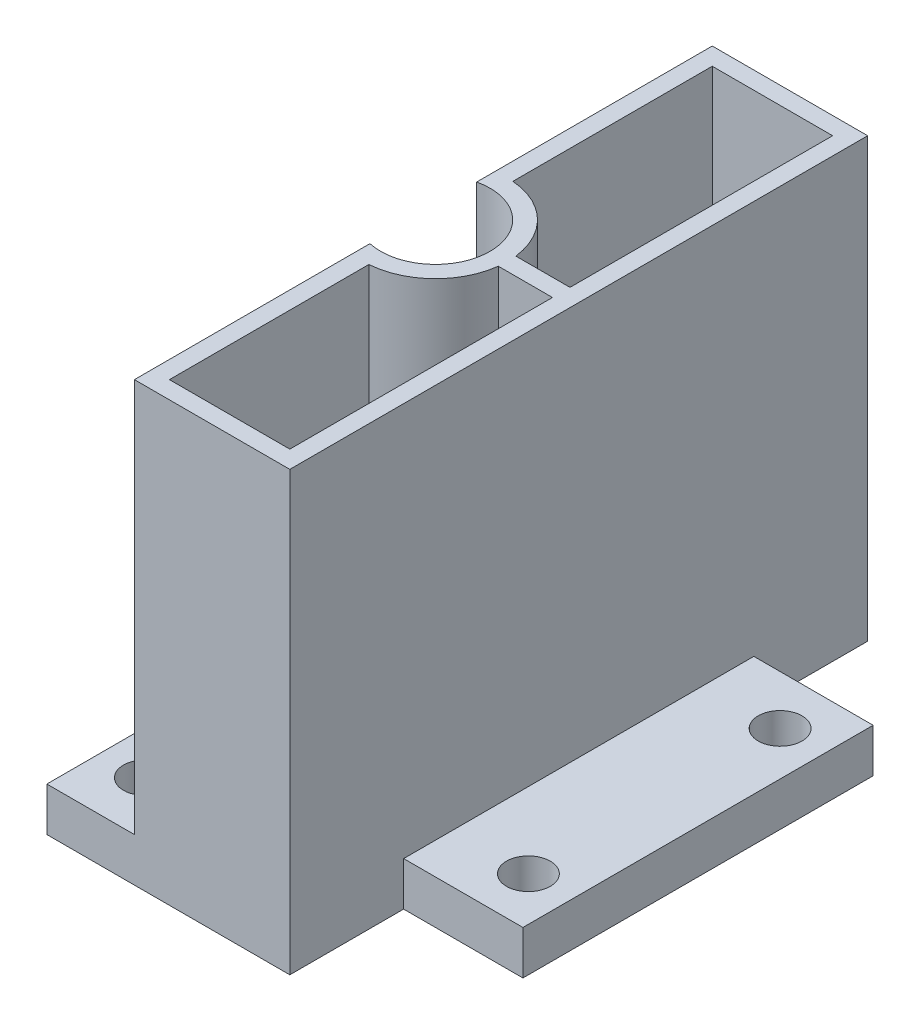
ISO-10303-21;
HEADER;
FILE_DESCRIPTION(('STEP AP214'),'2;1');
FILE_NAME('part.step','',(''),(''),'','','');
FILE_SCHEMA(('AUTOMOTIVE_DESIGN { 1 0 10303 214 1 1 1 1 }'));
ENDSEC;
DATA;
#1=APPLICATION_CONTEXT('core data for automotive mechanical design processes');
#2=APPLICATION_PROTOCOL_DEFINITION('international standard','automotive_design',2000,#1);
#3=PRODUCT_CONTEXT('',#1,'mechanical');
#4=PRODUCT('Part','Part','',(#3));
#5=PRODUCT_RELATED_PRODUCT_CATEGORY('part','',(#4));
#6=PRODUCT_DEFINITION_FORMATION('','',#4);
#7=PRODUCT_DEFINITION_CONTEXT('part definition',#1,'design');
#8=PRODUCT_DEFINITION('design','',#6,#7);
#9=PRODUCT_DEFINITION_SHAPE('','',#8);
#10=(LENGTH_UNIT() NAMED_UNIT(*) SI_UNIT(.MILLI.,.METRE.));
#11=(NAMED_UNIT(*) PLANE_ANGLE_UNIT() SI_UNIT($,.RADIAN.));
#12=(NAMED_UNIT(*) SI_UNIT($,.STERADIAN.) SOLID_ANGLE_UNIT());
#13=UNCERTAINTY_MEASURE_WITH_UNIT(LENGTH_MEASURE(1.E-05),#10,'distance_accuracy_value','');
#14=(GEOMETRIC_REPRESENTATION_CONTEXT(3) GLOBAL_UNCERTAINTY_ASSIGNED_CONTEXT((#13)) GLOBAL_UNIT_ASSIGNED_CONTEXT((#10,
#11,#12)) REPRESENTATION_CONTEXT('',''));
#15=CARTESIAN_POINT('',(0.,0.,0.));
#16=DIRECTION('',(0.,0.,1.));
#17=DIRECTION('',(1.,0.,0.));
#18=AXIS2_PLACEMENT_3D('',#15,#16,#17);
#19=CARTESIAN_POINT('',(-0.906603032067286,20.,0.));
#20=DIRECTION('',(-1.,0.,0.));
#21=DIRECTION('',(0.,0.,1.));
#22=AXIS2_PLACEMENT_3D('',#19,#20,#21);
#23=PLANE('',#22);
#24=DIRECTION('',(0.,0.,-1.));
#25=VECTOR('',#24,1.);
#26=CARTESIAN_POINT('',(-0.906603032067286,0.,0.));
#27=LINE('',#26,#25);
#28=CARTESIAN_POINT('',(-0.906603032067321,0.,3.19999999999997));
#29=VERTEX_POINT('',#28);
#30=CARTESIAN_POINT('',(-0.906603032067313,0.,2.43874967965067));
#31=VERTEX_POINT('',#30);
#32=EDGE_CURVE('E442',#29,#31,#27,.T.);
#33=ORIENTED_EDGE('',*,*,#32,.F.);
#34=DIRECTION('',(0.,-1.,0.));
#35=VECTOR('',#34,1.);
#36=CARTESIAN_POINT('',(-0.906603032067321,2.,3.19999999999997));
#37=LINE('',#36,#35);
#38=CARTESIAN_POINT('',(-0.906603032067321,2.,3.19999999999997));
#39=VERTEX_POINT('',#38);
#40=EDGE_CURVE('E59',#39,#29,#37,.T.);
#41=ORIENTED_EDGE('',*,*,#40,.F.);
#42=DIRECTION('',(0.,0.,-1.));
#43=VECTOR('',#42,1.);
#44=CARTESIAN_POINT('',(-0.906603032067286,2.,0.));
#45=LINE('',#44,#43);
#46=CARTESIAN_POINT('',(-0.906603032067431,2.,13.2));
#47=VERTEX_POINT('',#46);
#48=EDGE_CURVE('E246',#47,#39,#45,.T.);
#49=ORIENTED_EDGE('',*,*,#48,.F.);
#50=DIRECTION('',(0.,-1.,0.));
#51=VECTOR('',#50,1.);
#52=CARTESIAN_POINT('',(-0.906603032067431,20.,13.2));
#53=LINE('',#52,#51);
#54=CARTESIAN_POINT('',(-0.906603032067431,20.,13.2));
#55=VERTEX_POINT('',#54);
#56=EDGE_CURVE('E244',#55,#47,#53,.T.);
#57=ORIENTED_EDGE('',*,*,#56,.F.);
#58=DIRECTION('',(0.,0.,-1.));
#59=VECTOR('',#58,1.);
#60=CARTESIAN_POINT('',(-0.906603032067286,20.,0.));
#61=LINE('',#60,#59);
#62=CARTESIAN_POINT('',(-0.906603032067313,20.,2.43874967965067));
#63=VERTEX_POINT('',#62);
#64=EDGE_CURVE('E383',#55,#63,#61,.T.);
#65=ORIENTED_EDGE('',*,*,#64,.T.);
#66=DIRECTION('',(0.,-1.,0.));
#67=VECTOR('',#66,1.);
#68=CARTESIAN_POINT('',(-0.906603032067313,20.,2.43874967965067));
#69=LINE('',#68,#67);
#70=EDGE_CURVE('E45',#63,#31,#69,.T.);
#71=ORIENTED_EDGE('',*,*,#70,.T.);
#72=EDGE_LOOP('',(#33,#41,#49,#57,#65,#71));
#73=FACE_BOUND('',#72,.T.);
#74=ADVANCED_FACE('F41',(#73),#23,.T.);
#75=CARTESIAN_POINT('',(6.19339696793819,20.,0.));
#76=DIRECTION('',(-1.,0.,0.));
#77=DIRECTION('',(0.,0.,1.));
#78=AXIS2_PLACEMENT_3D('',#75,#76,#77);
#79=PLANE('',#78);
#80=DIRECTION('',(0.,-1.,0.));
#81=VECTOR('',#80,1.);
#82=CARTESIAN_POINT('',(6.19339696793822,2.,7.99999999999994));
#83=LINE('',#82,#81);
#84=CARTESIAN_POINT('',(6.19339696793822,2.,7.99999999999994));
#85=VERTEX_POINT('',#84);
#86=CARTESIAN_POINT('',(6.19339696793822,0.,7.99999999999994));
#87=VERTEX_POINT('',#86);
#88=EDGE_CURVE('E372',#85,#87,#83,.T.);
#89=ORIENTED_EDGE('',*,*,#88,.F.);
#90=DIRECTION('',(0.,0.,-1.));
#91=VECTOR('',#90,1.);
#92=CARTESIAN_POINT('',(6.19339696793819,2.,0.));
#93=LINE('',#92,#91);
#94=CARTESIAN_POINT('',(6.19339696793816,2.,-8.00000000000006));
#95=VERTEX_POINT('',#94);
#96=EDGE_CURVE('E338',#85,#95,#93,.T.);
#97=ORIENTED_EDGE('',*,*,#96,.T.);
#98=DIRECTION('',(0.,-1.,0.));
#99=VECTOR('',#98,1.);
#100=CARTESIAN_POINT('',(6.19339696793816,2.,-8.00000000000006));
#101=LINE('',#100,#99);
#102=CARTESIAN_POINT('',(6.19339696793816,0.,-8.00000000000006));
#103=VERTEX_POINT('',#102);
#104=EDGE_CURVE('E375',#95,#103,#101,.T.);
#105=ORIENTED_EDGE('',*,*,#104,.T.);
#106=DIRECTION('',(0.,0.,-1.));
#107=VECTOR('',#106,1.);
#108=CARTESIAN_POINT('',(6.19339696793819,0.,0.));
#109=LINE('',#108,#107);
#110=CARTESIAN_POINT('',(6.19339696793835,0.,-13.2));
#111=VERTEX_POINT('',#110);
#112=EDGE_CURVE('E448',#103,#111,#109,.T.);
#113=ORIENTED_EDGE('',*,*,#112,.T.);
#114=DIRECTION('',(0.,-1.,0.));
#115=VECTOR('',#114,1.);
#116=CARTESIAN_POINT('',(6.19339696793835,20.,-13.2));
#117=LINE('',#116,#115);
#118=CARTESIAN_POINT('',(6.19339696793835,20.,-13.2));
#119=VERTEX_POINT('',#118);
#120=EDGE_CURVE('E533',#119,#111,#117,.T.);
#121=ORIENTED_EDGE('',*,*,#120,.F.);
#122=DIRECTION('',(0.,0.,-1.));
#123=VECTOR('',#122,1.);
#124=CARTESIAN_POINT('',(6.19339696793819,20.,0.));
#125=LINE('',#124,#123);
#126=CARTESIAN_POINT('',(6.19339696793811,20.,13.2));
#127=VERTEX_POINT('',#126);
#128=EDGE_CURVE('E391',#127,#119,#125,.T.);
#129=ORIENTED_EDGE('',*,*,#128,.F.);
#130=DIRECTION('',(0.,-1.,0.));
#131=VECTOR('',#130,1.);
#132=CARTESIAN_POINT('',(6.19339696793811,20.,13.2));
#133=LINE('',#132,#131);
#134=CARTESIAN_POINT('',(6.19339696793811,0.,13.2));
#135=VERTEX_POINT('',#134);
#136=EDGE_CURVE('E537',#127,#135,#133,.T.);
#137=ORIENTED_EDGE('',*,*,#136,.T.);
#138=EDGE_CURVE('E449',#135,#87,#109,.T.);
#139=ORIENTED_EDGE('',*,*,#138,.T.);
#140=EDGE_LOOP('',(#89,#97,#105,#113,#121,#129,#137,#139));
#141=FACE_BOUND('',#140,.T.);
#142=ADVANCED_FACE('F575',(#141),#79,.F.);
#143=CARTESIAN_POINT('',(-0.106603032064528,20.,0.));
#144=DIRECTION('',(-1.,0.,0.));
#145=DIRECTION('',(0.,0.,1.));
#146=AXIS2_PLACEMENT_3D('',#143,#144,#145);
#147=PLANE('',#146);
#148=DIRECTION('',(0.,0.,-1.));
#149=VECTOR('',#148,1.);
#150=CARTESIAN_POINT('',(-0.106603032064528,0.,0.));
#151=LINE('',#150,#149);
#152=CARTESIAN_POINT('',(-0.106603032064528,0.,12.3999999999999));
#153=VERTEX_POINT('',#152);
#154=CARTESIAN_POINT('',(-0.106603032064528,0.,3.29051667675444));
#155=VERTEX_POINT('',#154);
#156=EDGE_CURVE('E480',#153,#155,#151,.T.);
#157=ORIENTED_EDGE('',*,*,#156,.T.);
#158=DIRECTION('',(0.,-1.,0.));
#159=VECTOR('',#158,1.);
#160=CARTESIAN_POINT('',(-0.106603032064528,20.,3.29051667675444));
#161=LINE('',#160,#159);
#162=CARTESIAN_POINT('',(-0.106603032064528,20.,3.29051667675444));
#163=VERTEX_POINT('',#162);
#164=EDGE_CURVE('E11',#163,#155,#161,.T.);
#165=ORIENTED_EDGE('',*,*,#164,.F.);
#166=DIRECTION('',(0.,0.,-1.));
#167=VECTOR('',#166,1.);
#168=CARTESIAN_POINT('',(-0.106603032064528,20.,0.));
#169=LINE('',#168,#167);
#170=CARTESIAN_POINT('',(-0.106603032064528,20.,12.3999999999999));
#171=VERTEX_POINT('',#170);
#172=EDGE_CURVE('E420',#171,#163,#169,.T.);
#173=ORIENTED_EDGE('',*,*,#172,.F.);
#174=DIRECTION('',(0.,-1.,0.));
#175=VECTOR('',#174,1.);
#176=CARTESIAN_POINT('',(-0.106603032064528,20.,12.3999999999999));
#177=LINE('',#176,#175);
#178=EDGE_CURVE('E498',#171,#153,#177,.T.);
#179=ORIENTED_EDGE('',*,*,#178,.T.);
#180=EDGE_LOOP('',(#157,#165,#173,#179));
#181=FACE_BOUND('',#180,.T.);
#182=ADVANCED_FACE('F607',(#181),#147,.F.);
#183=CARTESIAN_POINT('',(-0.35660303206454,20.,-1.41813644161104E-13));
#184=DIRECTION('',(0.,-1.,0.));
#185=DIRECTION('',(0.,0.,-1.));
#186=AXIS2_PLACEMENT_3D('',#183,#184,#185);
#187=CYLINDRICAL_SURFACE('',#186,3.3);
#188=CARTESIAN_POINT('',(-0.35660303206454,0.,-1.41813644161104E-13));
#189=DIRECTION('',(0.,1.,0.));
#190=DIRECTION('',(0.,0.,1.));
#191=AXIS2_PLACEMENT_3D('',#188,#189,#190);
#192=CIRCLE('',#191,3.3);
#193=CARTESIAN_POINT('',(2.9190648387673,0.,0.399999999999847));
#194=VERTEX_POINT('',#193);
#195=EDGE_CURVE('E484',#155,#194,#192,.T.);
#196=ORIENTED_EDGE('',*,*,#195,.T.);
#197=DIRECTION('',(0.,-1.,0.));
#198=VECTOR('',#197,1.);
#199=CARTESIAN_POINT('',(2.9190648387673,20.,0.399999999999847));
#200=LINE('',#199,#198);
#201=CARTESIAN_POINT('',(2.9190648387673,20.,0.399999999999847));
#202=VERTEX_POINT('',#201);
#203=EDGE_CURVE('E51',#202,#194,#200,.T.);
#204=ORIENTED_EDGE('',*,*,#203,.F.);
#205=CARTESIAN_POINT('',(-0.35660303206454,20.,-1.41813644161104E-13));
#206=DIRECTION('',(0.,1.,0.));
#207=DIRECTION('',(0.,0.,1.));
#208=AXIS2_PLACEMENT_3D('',#205,#206,#207);
#209=CIRCLE('',#208,3.3);
#210=EDGE_CURVE('E424',#163,#202,#209,.T.);
#211=ORIENTED_EDGE('',*,*,#210,.F.);
#212=ORIENTED_EDGE('',*,*,#164,.T.);
#213=EDGE_LOOP('',(#196,#204,#211,#212));
#214=FACE_BOUND('',#213,.T.);
#215=ADVANCED_FACE('F640',(#214),#187,.T.);
#216=CARTESIAN_POINT('',(0.,20.,0.399999999999847));
#217=DIRECTION('',(0.,0.,-1.));
#218=DIRECTION('',(-1.,0.,0.));
#219=AXIS2_PLACEMENT_3D('',#216,#217,#218);
#220=PLANE('',#219);
#221=DIRECTION('',(1.,0.,0.));
#222=VECTOR('',#221,1.);
#223=CARTESIAN_POINT('',(0.,0.,0.399999999999847));
#224=LINE('',#223,#222);
#225=CARTESIAN_POINT('',(5.39339696793547,0.,0.399999999999847));
#226=VERTEX_POINT('',#225);
#227=EDGE_CURVE('E487',#194,#226,#224,.T.);
#228=ORIENTED_EDGE('',*,*,#227,.T.);
#229=DIRECTION('',(0.,-1.,0.));
#230=VECTOR('',#229,1.);
#231=CARTESIAN_POINT('',(5.39339696793547,20.,0.399999999999847));
#232=LINE('',#231,#230);
#233=CARTESIAN_POINT('',(5.39339696793547,20.,0.399999999999847));
#234=VERTEX_POINT('',#233);
#235=EDGE_CURVE('E505',#234,#226,#232,.T.);
#236=ORIENTED_EDGE('',*,*,#235,.F.);
#237=DIRECTION('',(1.,0.,0.));
#238=VECTOR('',#237,1.);
#239=CARTESIAN_POINT('',(0.,20.,0.399999999999847));
#240=LINE('',#239,#238);
#241=EDGE_CURVE('E427',#202,#234,#240,.T.);
#242=ORIENTED_EDGE('',*,*,#241,.F.);
#243=ORIENTED_EDGE('',*,*,#203,.T.);
#244=EDGE_LOOP('',(#228,#236,#242,#243));
#245=FACE_BOUND('',#244,.T.);
#246=ADVANCED_FACE('F644',(#245),#220,.F.);
#247=CARTESIAN_POINT('',(5.39339696793547,20.,0.));
#248=DIRECTION('',(-1.,0.,0.));
#249=DIRECTION('',(0.,0.,1.));
#250=AXIS2_PLACEMENT_3D('',#247,#248,#249);
#251=PLANE('',#250);
#252=DIRECTION('',(0.,0.,-1.));
#253=VECTOR('',#252,1.);
#254=CARTESIAN_POINT('',(5.39339696793547,0.,0.));
#255=LINE('',#254,#253);
#256=CARTESIAN_POINT('',(5.39339696793547,0.,12.3999999999999));
#257=VERTEX_POINT('',#256);
#258=EDGE_CURVE('E491',#257,#226,#255,.T.);
#259=ORIENTED_EDGE('',*,*,#258,.F.);
#260=DIRECTION('',(0.,-1.,0.));
#261=VECTOR('',#260,1.);
#262=CARTESIAN_POINT('',(5.39339696793547,20.,12.3999999999999));
#263=LINE('',#262,#261);
#264=CARTESIAN_POINT('',(5.39339696793547,20.,12.3999999999999));
#265=VERTEX_POINT('',#264);
#266=EDGE_CURVE('E501',#265,#257,#263,.T.);
#267=ORIENTED_EDGE('',*,*,#266,.F.);
#268=DIRECTION('',(0.,0.,-1.));
#269=VECTOR('',#268,1.);
#270=CARTESIAN_POINT('',(5.39339696793547,20.,0.));
#271=LINE('',#270,#269);
#272=EDGE_CURVE('E430',#265,#234,#271,.T.);
#273=ORIENTED_EDGE('',*,*,#272,.T.);
#274=ORIENTED_EDGE('',*,*,#235,.T.);
#275=EDGE_LOOP('',(#259,#267,#273,#274));
#276=FACE_BOUND('',#275,.T.);
#277=ADVANCED_FACE('F622',(#276),#251,.T.);
#278=CARTESIAN_POINT('',(0.,20.,-0.400000000000153));
#279=DIRECTION('',(0.,0.,1.));
#280=DIRECTION('',(1.,0.,0.));
#281=AXIS2_PLACEMENT_3D('',#278,#279,#280);
#282=PLANE('',#281);
#283=DIRECTION('',(-1.,0.,0.));
#284=VECTOR('',#283,1.);
#285=CARTESIAN_POINT('',(0.,0.,-0.400000000000153));
#286=LINE('',#285,#284);
#287=CARTESIAN_POINT('',(5.39339696793546,0.,-0.400000000000153));
#288=VERTEX_POINT('',#287);
#289=CARTESIAN_POINT('',(2.9190648387673,0.,-0.400000000000153));
#290=VERTEX_POINT('',#289);
#291=EDGE_CURVE('E461',#288,#290,#286,.T.);
#292=ORIENTED_EDGE('',*,*,#291,.T.);
#293=DIRECTION('',(0.,-1.,0.));
#294=VECTOR('',#293,1.);
#295=CARTESIAN_POINT('',(2.9190648387673,20.,-0.400000000000153));
#296=LINE('',#295,#294);
#297=CARTESIAN_POINT('',(2.9190648387673,20.,-0.400000000000153));
#298=VERTEX_POINT('',#297);
#299=EDGE_CURVE('E502',#298,#290,#296,.T.);
#300=ORIENTED_EDGE('',*,*,#299,.F.);
#301=DIRECTION('',(-1.,0.,0.));
#302=VECTOR('',#301,1.);
#303=CARTESIAN_POINT('',(0.,20.,-0.400000000000153));
#304=LINE('',#303,#302);
#305=CARTESIAN_POINT('',(5.39339696793546,20.,-0.400000000000153));
#306=VERTEX_POINT('',#305);
#307=EDGE_CURVE('E402',#306,#298,#304,.T.);
#308=ORIENTED_EDGE('',*,*,#307,.F.);
#309=DIRECTION('',(0.,-1.,0.));
#310=VECTOR('',#309,1.);
#311=CARTESIAN_POINT('',(5.39339696793546,20.,-0.400000000000153));
#312=LINE('',#311,#310);
#313=EDGE_CURVE('E511',#306,#288,#312,.T.);
#314=ORIENTED_EDGE('',*,*,#313,.T.);
#315=EDGE_LOOP('',(#292,#300,#308,#314));
#316=FACE_BOUND('',#315,.T.);
#317=ADVANCED_FACE('F618',(#316),#282,.F.);
#318=CARTESIAN_POINT('',(-0.35660303206454,20.,-1.41813644161104E-13));
#319=DIRECTION('',(0.,-1.,0.));
#320=DIRECTION('',(0.,0.,-1.));
#321=AXIS2_PLACEMENT_3D('',#318,#319,#320);
#322=CYLINDRICAL_SURFACE('',#321,3.3);
#323=CARTESIAN_POINT('',(-0.35660303206454,0.,-1.41813644161104E-13));
#324=DIRECTION('',(0.,1.,0.));
#325=DIRECTION('',(0.,0.,1.));
#326=AXIS2_PLACEMENT_3D('',#323,#324,#325);
#327=CIRCLE('',#326,3.3);
#328=CARTESIAN_POINT('',(-0.106603032064551,0.,-3.29051667675472));
#329=VERTEX_POINT('',#328);
#330=EDGE_CURVE('E465',#290,#329,#327,.T.);
#331=ORIENTED_EDGE('',*,*,#330,.T.);
#332=DIRECTION('',(0.,-1.,0.));
#333=VECTOR('',#332,1.);
#334=CARTESIAN_POINT('',(-0.106603032064551,20.,-3.29051667675472));
#335=LINE('',#334,#333);
#336=CARTESIAN_POINT('',(-0.106603032064551,20.,-3.29051667675472));
#337=VERTEX_POINT('',#336);
#338=EDGE_CURVE('E520',#337,#329,#335,.T.);
#339=ORIENTED_EDGE('',*,*,#338,.F.);
#340=CARTESIAN_POINT('',(-0.35660303206454,20.,-1.41813644161104E-13));
#341=DIRECTION('',(0.,1.,0.));
#342=DIRECTION('',(0.,0.,1.));
#343=AXIS2_PLACEMENT_3D('',#340,#341,#342);
#344=CIRCLE('',#343,3.3);
#345=EDGE_CURVE('E406',#298,#337,#344,.T.);
#346=ORIENTED_EDGE('',*,*,#345,.F.);
#347=ORIENTED_EDGE('',*,*,#299,.T.);
#348=EDGE_LOOP('',(#331,#339,#346,#347));
#349=FACE_BOUND('',#348,.T.);
#350=ADVANCED_FACE('F621',(#349),#322,.T.);
#351=CARTESIAN_POINT('',(-0.106603032064551,20.,0.));
#352=DIRECTION('',(-1.,0.,0.));
#353=DIRECTION('',(0.,0.,1.));
#354=AXIS2_PLACEMENT_3D('',#351,#352,#353);
#355=PLANE('',#354);
#356=DIRECTION('',(0.,0.,-1.));
#357=VECTOR('',#356,1.);
#358=CARTESIAN_POINT('',(-0.106603032064551,0.,0.));
#359=LINE('',#358,#357);
#360=CARTESIAN_POINT('',(-0.106603032064551,0.,-12.4000000000001));
#361=VERTEX_POINT('',#360);
#362=EDGE_CURVE('E468',#329,#361,#359,.T.);
#363=ORIENTED_EDGE('',*,*,#362,.T.);
#364=DIRECTION('',(0.,-1.,0.));
#365=VECTOR('',#364,1.);
#366=CARTESIAN_POINT('',(-0.106603032064551,20.,-12.4000000000001));
#367=LINE('',#366,#365);
#368=CARTESIAN_POINT('',(-0.106603032064551,20.,-12.4000000000001));
#369=VERTEX_POINT('',#368);
#370=EDGE_CURVE('E517',#369,#361,#367,.T.);
#371=ORIENTED_EDGE('',*,*,#370,.F.);
#372=DIRECTION('',(0.,0.,-1.));
#373=VECTOR('',#372,1.);
#374=CARTESIAN_POINT('',(-0.106603032064551,20.,0.));
#375=LINE('',#374,#373);
#376=EDGE_CURVE('E409',#337,#369,#375,.T.);
#377=ORIENTED_EDGE('',*,*,#376,.F.);
#378=ORIENTED_EDGE('',*,*,#338,.T.);
#379=EDGE_LOOP('',(#363,#371,#377,#378));
#380=FACE_BOUND('',#379,.T.);
#381=ADVANCED_FACE('F626',(#380),#355,.F.);
#382=CARTESIAN_POINT('',(0.,20.,-12.4000000000001));
#383=DIRECTION('',(0.,0.,1.));
#384=DIRECTION('',(1.,0.,0.));
#385=AXIS2_PLACEMENT_3D('',#382,#383,#384);
#386=PLANE('',#385);
#387=DIRECTION('',(-1.,0.,0.));
#388=VECTOR('',#387,1.);
#389=CARTESIAN_POINT('',(0.,0.,-12.4000000000001));
#390=LINE('',#389,#388);
#391=CARTESIAN_POINT('',(5.39339696793546,0.,-12.4000000000001));
#392=VERTEX_POINT('',#391);
#393=EDGE_CURVE('E472',#392,#361,#390,.T.);
#394=ORIENTED_EDGE('',*,*,#393,.F.);
#395=DIRECTION('',(0.,-1.,0.));
#396=VECTOR('',#395,1.);
#397=CARTESIAN_POINT('',(5.39339696793546,20.,-12.4000000000001));
#398=LINE('',#397,#396);
#399=CARTESIAN_POINT('',(5.39339696793546,20.,-12.4000000000001));
#400=VERTEX_POINT('',#399);
#401=EDGE_CURVE('E514',#400,#392,#398,.T.);
#402=ORIENTED_EDGE('',*,*,#401,.F.);
#403=DIRECTION('',(-1.,0.,0.));
#404=VECTOR('',#403,1.);
#405=CARTESIAN_POINT('',(0.,20.,-12.4000000000001));
#406=LINE('',#405,#404);
#407=EDGE_CURVE('E412',#400,#369,#406,.T.);
#408=ORIENTED_EDGE('',*,*,#407,.T.);
#409=ORIENTED_EDGE('',*,*,#370,.T.);
#410=EDGE_LOOP('',(#394,#402,#408,#409));
#411=FACE_BOUND('',#410,.T.);
#412=ADVANCED_FACE('F630',(#411),#386,.T.);
#413=CARTESIAN_POINT('',(-0.35660303206454,20.,-1.41813644161104E-13));
#414=DIRECTION('',(0.,-1.,0.));
#415=DIRECTION('',(0.,0.,-1.));
#416=AXIS2_PLACEMENT_3D('',#413,#414,#415);
#417=CYLINDRICAL_SURFACE('',#416,2.5);
#418=CARTESIAN_POINT('',(-0.35660303206454,0.,-1.41813644161104E-13));
#419=DIRECTION('',(0.,1.,0.));
#420=DIRECTION('',(0.,0.,1.));
#421=AXIS2_PLACEMENT_3D('',#418,#419,#420);
#422=CIRCLE('',#421,2.5);
#423=CARTESIAN_POINT('',(-0.906603032067313,0.,-2.43874967965096));
#424=VERTEX_POINT('',#423);
#425=EDGE_CURVE('E378',#31,#424,#422,.T.);
#426=ORIENTED_EDGE('',*,*,#425,.F.);
#427=ORIENTED_EDGE('',*,*,#70,.F.);
#428=CARTESIAN_POINT('',(-0.35660303206454,20.,-1.41813644161104E-13));
#429=DIRECTION('',(0.,1.,0.));
#430=DIRECTION('',(0.,0.,1.));
#431=AXIS2_PLACEMENT_3D('',#428,#429,#430);
#432=CIRCLE('',#431,2.5);
#433=CARTESIAN_POINT('',(-0.906603032067313,20.,-2.43874967965096));
#434=VERTEX_POINT('',#433);
#435=EDGE_CURVE('E379',#63,#434,#432,.T.);
#436=ORIENTED_EDGE('',*,*,#435,.T.);
#437=DIRECTION('',(0.,-1.,0.));
#438=VECTOR('',#437,1.);
#439=CARTESIAN_POINT('',(-0.906603032067313,20.,-2.43874967965096));
#440=LINE('',#439,#438);
#441=EDGE_CURVE('E438',#434,#424,#440,.T.);
#442=ORIENTED_EDGE('',*,*,#441,.T.);
#443=EDGE_LOOP('',(#426,#427,#436,#442));
#444=FACE_BOUND('',#443,.T.);
#445=ADVANCED_FACE('F43',(#444),#417,.F.);
#446=CARTESIAN_POINT('',(-1.16104309265286E-13,20.,13.2));
#447=DIRECTION('',(0.,0.,-1.));
#448=DIRECTION('',(-1.,0.,0.));
#449=AXIS2_PLACEMENT_3D('',#446,#447,#448);
#450=PLANE('',#449);
#451=DIRECTION('',(1.,0.,0.));
#452=VECTOR('',#451,1.);
#453=CARTESIAN_POINT('',(-1.16104309265286E-13,0.,13.2));
#454=LINE('',#453,#452);
#455=CARTESIAN_POINT('',(-4.90660303206743,0.,13.2));
#456=VERTEX_POINT('',#455);
#457=EDGE_CURVE('E445',#456,#135,#454,.T.);
#458=ORIENTED_EDGE('',*,*,#457,.T.);
#459=ORIENTED_EDGE('',*,*,#136,.F.);
#460=DIRECTION('',(1.,0.,0.));
#461=VECTOR('',#460,1.);
#462=CARTESIAN_POINT('',(-1.16104309265286E-13,20.,13.2));
#463=LINE('',#462,#461);
#464=EDGE_CURVE('E388',#55,#127,#463,.T.);
#465=ORIENTED_EDGE('',*,*,#464,.F.);
#466=ORIENTED_EDGE('',*,*,#56,.T.);
#467=DIRECTION('',(-1.,0.,0.));
#468=VECTOR('',#467,1.);
#469=CARTESIAN_POINT('',(0.,2.,13.2));
#470=LINE('',#469,#468);
#471=CARTESIAN_POINT('',(-4.90660303206743,2.,13.2));
#472=VERTEX_POINT('',#471);
#473=EDGE_CURVE('E234',#47,#472,#470,.T.);
#474=ORIENTED_EDGE('',*,*,#473,.T.);
#475=DIRECTION('',(0.,-1.,0.));
#476=VECTOR('',#475,1.);
#477=CARTESIAN_POINT('',(-4.90660303206743,2.,13.2));
#478=LINE('',#477,#476);
#479=EDGE_CURVE('E219',#472,#456,#478,.T.);
#480=ORIENTED_EDGE('',*,*,#479,.T.);
#481=EDGE_LOOP('',(#458,#459,#465,#466,#474,#480));
#482=FACE_BOUND('',#481,.T.);
#483=ADVANCED_FACE('F242',(#482),#450,.F.);
#484=CARTESIAN_POINT('',(1.16104309265287E-13,20.,-13.2));
#485=DIRECTION('',(0.,0.,-1.));
#486=DIRECTION('',(-1.,0.,0.));
#487=AXIS2_PLACEMENT_3D('',#484,#485,#486);
#488=PLANE('',#487);
#489=DIRECTION('',(1.,0.,0.));
#490=VECTOR('',#489,1.);
#491=CARTESIAN_POINT('',(1.16104309265287E-13,0.,-13.2));
#492=LINE('',#491,#490);
#493=CARTESIAN_POINT('',(-4.90660303206719,0.,-13.2));
#494=VERTEX_POINT('',#493);
#495=EDGE_CURVE('E453',#494,#111,#492,.T.);
#496=ORIENTED_EDGE('',*,*,#495,.F.);
#497=DIRECTION('',(0.,-1.,0.));
#498=VECTOR('',#497,1.);
#499=CARTESIAN_POINT('',(-4.90660303206719,2.,-13.2));
#500=LINE('',#499,#498);
#501=CARTESIAN_POINT('',(-4.90660303206719,2.,-13.2));
#502=VERTEX_POINT('',#501);
#503=EDGE_CURVE('E320',#502,#494,#500,.T.);
#504=ORIENTED_EDGE('',*,*,#503,.F.);
#505=DIRECTION('',(-1.,0.,0.));
#506=VECTOR('',#505,1.);
#507=CARTESIAN_POINT('',(0.,2.,-13.2));
#508=LINE('',#507,#506);
#509=CARTESIAN_POINT('',(-0.906603032067195,2.,-13.2));
#510=VERTEX_POINT('',#509);
#511=EDGE_CURVE('E285',#510,#502,#508,.T.);
#512=ORIENTED_EDGE('',*,*,#511,.F.);
#513=DIRECTION('',(0.,-1.,0.));
#514=VECTOR('',#513,1.);
#515=CARTESIAN_POINT('',(-0.906603032067195,20.,-13.2));
#516=LINE('',#515,#514);
#517=CARTESIAN_POINT('',(-0.906603032067195,20.,-13.2));
#518=VERTEX_POINT('',#517);
#519=EDGE_CURVE('E529',#518,#510,#516,.T.);
#520=ORIENTED_EDGE('',*,*,#519,.F.);
#521=DIRECTION('',(1.,0.,0.));
#522=VECTOR('',#521,1.);
#523=CARTESIAN_POINT('',(1.16104309265287E-13,20.,-13.2));
#524=LINE('',#523,#522);
#525=EDGE_CURVE('E394',#518,#119,#524,.T.);
#526=ORIENTED_EDGE('',*,*,#525,.T.);
#527=ORIENTED_EDGE('',*,*,#120,.T.);
#528=EDGE_LOOP('',(#496,#504,#512,#520,#526,#527));
#529=FACE_BOUND('',#528,.T.);
#530=ADVANCED_FACE('F569',(#529),#488,.T.);
#531=CARTESIAN_POINT('',(5.39339696793546,20.,0.));
#532=DIRECTION('',(-1.,0.,0.));
#533=DIRECTION('',(0.,0.,1.));
#534=AXIS2_PLACEMENT_3D('',#531,#532,#533);
#535=PLANE('',#534);
#536=DIRECTION('',(0.,0.,-1.));
#537=VECTOR('',#536,1.);
#538=CARTESIAN_POINT('',(5.39339696793546,0.,0.));
#539=LINE('',#538,#537);
#540=EDGE_CURVE('E476',#288,#392,#539,.T.);
#541=ORIENTED_EDGE('',*,*,#540,.F.);
#542=ORIENTED_EDGE('',*,*,#313,.F.);
#543=DIRECTION('',(0.,0.,-1.));
#544=VECTOR('',#543,1.);
#545=CARTESIAN_POINT('',(5.39339696793546,20.,0.));
#546=LINE('',#545,#544);
#547=EDGE_CURVE('E416',#306,#400,#546,.T.);
#548=ORIENTED_EDGE('',*,*,#547,.T.);
#549=ORIENTED_EDGE('',*,*,#401,.T.);
#550=EDGE_LOOP('',(#541,#542,#548,#549));
#551=FACE_BOUND('',#550,.T.);
#552=ADVANCED_FACE('F614',(#551),#535,.T.);
#553=CARTESIAN_POINT('',(-0.90660303206734,20.,0.));
#554=DIRECTION('',(-1.,0.,0.));
#555=DIRECTION('',(0.,0.,1.));
#556=AXIS2_PLACEMENT_3D('',#553,#554,#555);
#557=PLANE('',#556);
#558=DIRECTION('',(0.,-1.,0.));
#559=VECTOR('',#558,1.);
#560=CARTESIAN_POINT('',(-0.906603032067305,2.,-3.20000000000003));
#561=LINE('',#560,#559);
#562=CARTESIAN_POINT('',(-0.906603032067305,2.,-3.20000000000003));
#563=VERTEX_POINT('',#562);
#564=CARTESIAN_POINT('',(-0.906603032067305,0.,-3.20000000000003));
#565=VERTEX_POINT('',#564);
#566=EDGE_CURVE('E299',#563,#565,#561,.T.);
#567=ORIENTED_EDGE('',*,*,#566,.T.);
#568=DIRECTION('',(0.,0.,-1.));
#569=VECTOR('',#568,1.);
#570=CARTESIAN_POINT('',(-0.90660303206734,0.,0.));
#571=LINE('',#570,#569);
#572=EDGE_CURVE('E457',#424,#565,#571,.T.);
#573=ORIENTED_EDGE('',*,*,#572,.F.);
#574=ORIENTED_EDGE('',*,*,#441,.F.);
#575=DIRECTION('',(0.,0.,-1.));
#576=VECTOR('',#575,1.);
#577=CARTESIAN_POINT('',(-0.90660303206734,20.,0.));
#578=LINE('',#577,#576);
#579=EDGE_CURVE('E398',#434,#518,#578,.T.);
#580=ORIENTED_EDGE('',*,*,#579,.T.);
#581=ORIENTED_EDGE('',*,*,#519,.T.);
#582=DIRECTION('',(0.,0.,-1.));
#583=VECTOR('',#582,1.);
#584=CARTESIAN_POINT('',(-0.90660303206734,2.,0.));
#585=LINE('',#584,#583);
#586=EDGE_CURVE('E296',#563,#510,#585,.T.);
#587=ORIENTED_EDGE('',*,*,#586,.F.);
#588=EDGE_LOOP('',(#567,#573,#574,#580,#581,#587));
#589=FACE_BOUND('',#588,.T.);
#590=ADVANCED_FACE('F554',(#589),#557,.T.);
#591=CARTESIAN_POINT('',(0.,20.,12.3999999999999));
#592=DIRECTION('',(0.,0.,-1.));
#593=DIRECTION('',(-1.,0.,0.));
#594=AXIS2_PLACEMENT_3D('',#591,#592,#593);
#595=PLANE('',#594);
#596=DIRECTION('',(1.,0.,0.));
#597=VECTOR('',#596,1.);
#598=CARTESIAN_POINT('',(0.,0.,12.3999999999999));
#599=LINE('',#598,#597);
#600=EDGE_CURVE('E384',#153,#257,#599,.T.);
#601=ORIENTED_EDGE('',*,*,#600,.F.);
#602=ORIENTED_EDGE('',*,*,#178,.F.);
#603=DIRECTION('',(1.,0.,0.));
#604=VECTOR('',#603,1.);
#605=CARTESIAN_POINT('',(0.,20.,12.3999999999999));
#606=LINE('',#605,#604);
#607=EDGE_CURVE('E434',#171,#265,#606,.T.);
#608=ORIENTED_EDGE('',*,*,#607,.T.);
#609=ORIENTED_EDGE('',*,*,#266,.T.);
#610=EDGE_LOOP('',(#601,#602,#608,#609));
#611=FACE_BOUND('',#610,.T.);
#612=ADVANCED_FACE('F617',(#611),#595,.T.);
#613=CARTESIAN_POINT('',(0.,20.,0.));
#614=DIRECTION('',(0.,1.,0.));
#615=DIRECTION('',(0.,0.,1.));
#616=AXIS2_PLACEMENT_3D('',#613,#614,#615);
#617=PLANE('',#616);
#618=ORIENTED_EDGE('',*,*,#435,.F.);
#619=ORIENTED_EDGE('',*,*,#64,.F.);
#620=ORIENTED_EDGE('',*,*,#464,.T.);
#621=ORIENTED_EDGE('',*,*,#128,.T.);
#622=ORIENTED_EDGE('',*,*,#525,.F.);
#623=ORIENTED_EDGE('',*,*,#579,.F.);
#624=EDGE_LOOP('',(#618,#619,#620,#621,#622,#623));
#625=FACE_BOUND('',#624,.T.);
#626=ORIENTED_EDGE('',*,*,#307,.T.);
#627=ORIENTED_EDGE('',*,*,#345,.T.);
#628=ORIENTED_EDGE('',*,*,#376,.T.);
#629=ORIENTED_EDGE('',*,*,#407,.F.);
#630=ORIENTED_EDGE('',*,*,#547,.F.);
#631=EDGE_LOOP('',(#626,#627,#628,#629,#630));
#632=FACE_BOUND('',#631,.T.);
#633=ORIENTED_EDGE('',*,*,#172,.T.);
#634=ORIENTED_EDGE('',*,*,#210,.T.);
#635=ORIENTED_EDGE('',*,*,#241,.T.);
#636=ORIENTED_EDGE('',*,*,#272,.F.);
#637=ORIENTED_EDGE('',*,*,#607,.F.);
#638=EDGE_LOOP('',(#633,#634,#635,#636,#637));
#639=FACE_BOUND('',#638,.T.);
#640=ADVANCED_FACE('F654',(#625,#632,#639),#617,.T.);
#641=CARTESIAN_POINT('',(0.,0.,0.));
#642=DIRECTION('',(0.,1.,0.));
#643=DIRECTION('',(0.,0.,1.));
#644=AXIS2_PLACEMENT_3D('',#641,#642,#643);
#645=PLANE('',#644);
#646=ORIENTED_EDGE('',*,*,#425,.T.);
#647=ORIENTED_EDGE('',*,*,#572,.T.);
#648=DIRECTION('',(-1.,0.,0.));
#649=VECTOR('',#648,1.);
#650=CARTESIAN_POINT('',(0.,0.,-3.20000000000003));
#651=LINE('',#650,#649);
#652=CARTESIAN_POINT('',(-4.90660303206719,0.,-3.20000000000003));
#653=VERTEX_POINT('',#652);
#654=EDGE_CURVE('E281',#565,#653,#651,.T.);
#655=ORIENTED_EDGE('',*,*,#654,.T.);
#656=DIRECTION('',(0.,0.,1.));
#657=VECTOR('',#656,1.);
#658=CARTESIAN_POINT('',(-4.90660303206719,0.,0.));
#659=LINE('',#658,#657);
#660=EDGE_CURVE('E307',#494,#653,#659,.T.);
#661=ORIENTED_EDGE('',*,*,#660,.F.);
#662=ORIENTED_EDGE('',*,*,#495,.T.);
#663=ORIENTED_EDGE('',*,*,#112,.F.);
#664=DIRECTION('',(1.,0.,0.));
#665=VECTOR('',#664,1.);
#666=CARTESIAN_POINT('',(0.,0.,-8.00000000000004));
#667=LINE('',#666,#665);
#668=CARTESIAN_POINT('',(11.6433969679382,0.,-8.00000000000007));
#669=VERTEX_POINT('',#668);
#670=EDGE_CURVE('E67',#103,#669,#667,.T.);
#671=ORIENTED_EDGE('',*,*,#670,.T.);
#672=DIRECTION('',(0.,0.,-1.));
#673=VECTOR('',#672,1.);
#674=CARTESIAN_POINT('',(11.6433969679382,0.,0.));
#675=LINE('',#674,#673);
#676=CARTESIAN_POINT('',(11.6433969679382,0.,7.99999999999992));
#677=VERTEX_POINT('',#676);
#678=EDGE_CURVE('E330',#677,#669,#675,.T.);
#679=ORIENTED_EDGE('',*,*,#678,.F.);
#680=DIRECTION('',(1.,0.,0.));
#681=VECTOR('',#680,1.);
#682=CARTESIAN_POINT('',(0.,0.,7.99999999999997));
#683=LINE('',#682,#681);
#684=EDGE_CURVE('E359',#87,#677,#683,.T.);
#685=ORIENTED_EDGE('',*,*,#684,.F.);
#686=ORIENTED_EDGE('',*,*,#138,.F.);
#687=ORIENTED_EDGE('',*,*,#457,.F.);
#688=DIRECTION('',(0.,0.,-1.));
#689=VECTOR('',#688,1.);
#690=CARTESIAN_POINT('',(-4.90660303206743,0.,0.));
#691=LINE('',#690,#689);
#692=CARTESIAN_POINT('',(-4.90660303206743,0.,3.19999999999997));
#693=VERTEX_POINT('',#692);
#694=EDGE_CURVE('E224',#456,#693,#691,.T.);
#695=ORIENTED_EDGE('',*,*,#694,.T.);
#696=DIRECTION('',(-1.,0.,0.));
#697=VECTOR('',#696,1.);
#698=CARTESIAN_POINT('',(0.,0.,3.19999999999997));
#699=LINE('',#698,#697);
#700=EDGE_CURVE('E265',#29,#693,#699,.T.);
#701=ORIENTED_EDGE('',*,*,#700,.F.);
#702=ORIENTED_EDGE('',*,*,#32,.T.);
#703=EDGE_LOOP('',(#646,#647,#655,#661,#662,#663,#671,#679,#685,#686,#687,#695,#701,#702));
#704=FACE_BOUND('',#703,.T.);
#705=ORIENTED_EDGE('',*,*,#291,.F.);
#706=ORIENTED_EDGE('',*,*,#540,.T.);
#707=ORIENTED_EDGE('',*,*,#393,.T.);
#708=ORIENTED_EDGE('',*,*,#362,.F.);
#709=ORIENTED_EDGE('',*,*,#330,.F.);
#710=EDGE_LOOP('',(#705,#706,#707,#708,#709));
#711=FACE_BOUND('',#710,.T.);
#712=ORIENTED_EDGE('',*,*,#156,.F.);
#713=ORIENTED_EDGE('',*,*,#600,.T.);
#714=ORIENTED_EDGE('',*,*,#258,.T.);
#715=ORIENTED_EDGE('',*,*,#227,.F.);
#716=ORIENTED_EDGE('',*,*,#195,.F.);
#717=EDGE_LOOP('',(#712,#713,#714,#715,#716));
#718=FACE_BOUND('',#717,.T.);
#719=CARTESIAN_POINT('',(9.64339696793817,0.,-5.75000000000007));
#720=DIRECTION('',(0.,1.,0.));
#721=DIRECTION('',(0.,0.,1.));
#722=AXIS2_PLACEMENT_3D('',#719,#720,#721);
#723=CIRCLE('',#722,1.);
#724=CARTESIAN_POINT('',(9.64339696793817,0.,-4.75000000000006));
#725=VERTEX_POINT('',#724);
#726=EDGE_CURVE('E324',#725,#725,#723,.T.);
#727=ORIENTED_EDGE('',*,*,#726,.T.);
#728=EDGE_LOOP('',(#727));
#729=FACE_BOUND('',#728,.T.);
#730=CARTESIAN_POINT('',(9.64339696793821,0.,5.74999999999993));
#731=DIRECTION('',(0.,1.,0.));
#732=DIRECTION('',(0.,0.,1.));
#733=AXIS2_PLACEMENT_3D('',#730,#731,#732);
#734=CIRCLE('',#733,1.);
#735=CARTESIAN_POINT('',(9.64339696793821,0.,6.74999999999993));
#736=VERTEX_POINT('',#735);
#737=EDGE_CURVE('E353',#736,#736,#734,.T.);
#738=ORIENTED_EDGE('',*,*,#737,.T.);
#739=EDGE_LOOP('',(#738));
#740=FACE_BOUND('',#739,.T.);
#741=CARTESIAN_POINT('',(-2.90660303206731,0.,-10.7));
#742=DIRECTION('',(0.,1.,0.));
#743=DIRECTION('',(0.,0.,1.));
#744=AXIS2_PLACEMENT_3D('',#741,#742,#743);
#745=CIRCLE('',#744,1.);
#746=CARTESIAN_POINT('',(-2.90660303206731,0.,-9.70000000000003));
#747=VERTEX_POINT('',#746);
#748=EDGE_CURVE('E228',#747,#747,#745,.T.);
#749=ORIENTED_EDGE('',*,*,#748,.T.);
#750=EDGE_LOOP('',(#749));
#751=FACE_BOUND('',#750,.T.);
#752=CARTESIAN_POINT('',(-2.90660303206731,0.,-5.70000000000003));
#753=DIRECTION('',(0.,1.,0.));
#754=DIRECTION('',(0.,0.,1.));
#755=AXIS2_PLACEMENT_3D('',#752,#753,#754);
#756=CIRCLE('',#755,1.);
#757=CARTESIAN_POINT('',(-2.90660303206731,0.,-4.70000000000003));
#758=VERTEX_POINT('',#757);
#759=EDGE_CURVE('E303',#758,#758,#756,.T.);
#760=ORIENTED_EDGE('',*,*,#759,.T.);
#761=EDGE_LOOP('',(#760));
#762=FACE_BOUND('',#761,.T.);
#763=CARTESIAN_POINT('',(-2.9066030320673,0.,5.69999999999993));
#764=DIRECTION('',(0.,1.,0.));
#765=DIRECTION('',(0.,0.,1.));
#766=AXIS2_PLACEMENT_3D('',#763,#764,#765);
#767=CIRCLE('',#766,0.999999999999999);
#768=CARTESIAN_POINT('',(-2.9066030320673,0.,6.69999999999993));
#769=VERTEX_POINT('',#768);
#770=EDGE_CURVE('E259',#769,#769,#767,.F.);
#771=ORIENTED_EDGE('',*,*,#770,.F.);
#772=EDGE_LOOP('',(#771));
#773=FACE_BOUND('',#772,.T.);
#774=CARTESIAN_POINT('',(-2.9066030320673,0.,10.6999999999999));
#775=DIRECTION('',(0.,1.,0.));
#776=DIRECTION('',(0.,0.,1.));
#777=AXIS2_PLACEMENT_3D('',#774,#775,#776);
#778=CIRCLE('',#777,1.);
#779=CARTESIAN_POINT('',(-2.9066030320673,0.,11.6999999999999));
#780=VERTEX_POINT('',#779);
#781=EDGE_CURVE('E268',#780,#780,#778,.F.);
#782=ORIENTED_EDGE('',*,*,#781,.F.);
#783=EDGE_LOOP('',(#782));
#784=FACE_BOUND('',#783,.T.);
#785=ADVANCED_FACE('F551',(#704,#711,#718,#729,#740,#751,#762,#773,#784),#645,.F.);
#786=CARTESIAN_POINT('',(0.,2.,-8.00000000000004));
#787=DIRECTION('',(0.,0.,-1.));
#788=DIRECTION('',(-1.,0.,0.));
#789=AXIS2_PLACEMENT_3D('',#786,#787,#788);
#790=PLANE('',#789);
#791=ORIENTED_EDGE('',*,*,#670,.F.);
#792=ORIENTED_EDGE('',*,*,#104,.F.);
#793=DIRECTION('',(1.,0.,0.));
#794=VECTOR('',#793,1.);
#795=CARTESIAN_POINT('',(0.,2.,-8.00000000000004));
#796=LINE('',#795,#794);
#797=CARTESIAN_POINT('',(11.6433969679382,2.,-8.00000000000007));
#798=VERTEX_POINT('',#797);
#799=EDGE_CURVE('E334',#95,#798,#796,.T.);
#800=ORIENTED_EDGE('',*,*,#799,.T.);
#801=DIRECTION('',(0.,-1.,0.));
#802=VECTOR('',#801,1.);
#803=CARTESIAN_POINT('',(11.6433969679382,2.,-8.00000000000007));
#804=LINE('',#803,#802);
#805=EDGE_CURVE('E349',#798,#669,#804,.T.);
#806=ORIENTED_EDGE('',*,*,#805,.T.);
#807=EDGE_LOOP('',(#791,#792,#800,#806));
#808=FACE_BOUND('',#807,.T.);
#809=ADVANCED_FACE('F579',(#808),#790,.T.);
#810=CARTESIAN_POINT('',(0.,2.,7.99999999999997));
#811=DIRECTION('',(0.,0.,-1.));
#812=DIRECTION('',(-1.,0.,0.));
#813=AXIS2_PLACEMENT_3D('',#810,#811,#812);
#814=PLANE('',#813);
#815=ORIENTED_EDGE('',*,*,#684,.T.);
#816=DIRECTION('',(0.,-1.,0.));
#817=VECTOR('',#816,1.);
#818=CARTESIAN_POINT('',(11.6433969679382,2.,7.99999999999992));
#819=LINE('',#818,#817);
#820=CARTESIAN_POINT('',(11.6433969679382,2.,7.99999999999992));
#821=VERTEX_POINT('',#820);
#822=EDGE_CURVE('E368',#821,#677,#819,.T.);
#823=ORIENTED_EDGE('',*,*,#822,.F.);
#824=DIRECTION('',(1.,0.,0.));
#825=VECTOR('',#824,1.);
#826=CARTESIAN_POINT('',(0.,2.,7.99999999999997));
#827=LINE('',#826,#825);
#828=EDGE_CURVE('E342',#85,#821,#827,.T.);
#829=ORIENTED_EDGE('',*,*,#828,.F.);
#830=ORIENTED_EDGE('',*,*,#88,.T.);
#831=EDGE_LOOP('',(#815,#823,#829,#830));
#832=FACE_BOUND('',#831,.T.);
#833=ADVANCED_FACE('F668',(#832),#814,.F.);
#834=CARTESIAN_POINT('',(9.64339696793821,2.,5.74999999999993));
#835=DIRECTION('',(0.,-1.,0.));
#836=DIRECTION('',(0.,0.,-1.));
#837=AXIS2_PLACEMENT_3D('',#834,#835,#836);
#838=CYLINDRICAL_SURFACE('',#837,1.);
#839=CARTESIAN_POINT('',(9.64339696793821,2.,5.74999999999993));
#840=DIRECTION('',(0.,1.,0.));
#841=DIRECTION('',(0.,0.,1.));
#842=AXIS2_PLACEMENT_3D('',#839,#840,#841);
#843=CIRCLE('',#842,1.);
#844=CARTESIAN_POINT('',(9.64339696793821,2.,6.74999999999993));
#845=VERTEX_POINT('',#844);
#846=EDGE_CURVE('E329',#845,#845,#843,.T.);
#847=ORIENTED_EDGE('',*,*,#846,.T.);
#848=EDGE_LOOP('',(#847));
#849=FACE_BOUND('',#848,.T.);
#850=ORIENTED_EDGE('',*,*,#737,.F.);
#851=EDGE_LOOP('',(#850));
#852=FACE_BOUND('',#851,.T.);
#853=ADVANCED_FACE('F664',(#849,#852),#838,.F.);
#854=CARTESIAN_POINT('',(9.64339696793817,2.,-5.75000000000007));
#855=DIRECTION('',(0.,-1.,0.));
#856=DIRECTION('',(0.,0.,-1.));
#857=AXIS2_PLACEMENT_3D('',#854,#855,#856);
#858=CYLINDRICAL_SURFACE('',#857,1.);
#859=CARTESIAN_POINT('',(9.64339696793817,2.,-5.75000000000007));
#860=DIRECTION('',(0.,1.,0.));
#861=DIRECTION('',(0.,0.,1.));
#862=AXIS2_PLACEMENT_3D('',#859,#860,#861);
#863=CIRCLE('',#862,1.);
#864=CARTESIAN_POINT('',(9.64339696793817,2.,-4.75000000000006));
#865=VERTEX_POINT('',#864);
#866=EDGE_CURVE('E325',#865,#865,#863,.T.);
#867=ORIENTED_EDGE('',*,*,#866,.T.);
#868=EDGE_LOOP('',(#867));
#869=FACE_BOUND('',#868,.T.);
#870=ORIENTED_EDGE('',*,*,#726,.F.);
#871=EDGE_LOOP('',(#870));
#872=FACE_BOUND('',#871,.T.);
#873=ADVANCED_FACE('F661',(#869,#872),#858,.F.);
#874=CARTESIAN_POINT('',(11.6433969679382,2.,0.));
#875=DIRECTION('',(-1.,0.,0.));
#876=DIRECTION('',(0.,0.,1.));
#877=AXIS2_PLACEMENT_3D('',#874,#875,#876);
#878=PLANE('',#877);
#879=ORIENTED_EDGE('',*,*,#678,.T.);
#880=ORIENTED_EDGE('',*,*,#805,.F.);
#881=DIRECTION('',(0.,0.,-1.));
#882=VECTOR('',#881,1.);
#883=CARTESIAN_POINT('',(11.6433969679382,2.,0.));
#884=LINE('',#883,#882);
#885=EDGE_CURVE('E346',#821,#798,#884,.T.);
#886=ORIENTED_EDGE('',*,*,#885,.F.);
#887=ORIENTED_EDGE('',*,*,#822,.T.);
#888=EDGE_LOOP('',(#879,#880,#886,#887));
#889=FACE_BOUND('',#888,.T.);
#890=ADVANCED_FACE('F585',(#889),#878,.F.);
#891=CARTESIAN_POINT('',(0.,2.,0.));
#892=DIRECTION('',(0.,1.,0.));
#893=DIRECTION('',(0.,0.,1.));
#894=AXIS2_PLACEMENT_3D('',#891,#892,#893);
#895=PLANE('',#894);
#896=ORIENTED_EDGE('',*,*,#866,.F.);
#897=EDGE_LOOP('',(#896));
#898=FACE_BOUND('',#897,.T.);
#899=ORIENTED_EDGE('',*,*,#846,.F.);
#900=EDGE_LOOP('',(#899));
#901=FACE_BOUND('',#900,.T.);
#902=ORIENTED_EDGE('',*,*,#799,.F.);
#903=ORIENTED_EDGE('',*,*,#96,.F.);
#904=ORIENTED_EDGE('',*,*,#828,.T.);
#905=ORIENTED_EDGE('',*,*,#885,.T.);
#906=EDGE_LOOP('',(#902,#903,#904,#905));
#907=FACE_BOUND('',#906,.T.);
#908=ADVANCED_FACE('F581',(#898,#901,#907),#895,.T.);
#909=CARTESIAN_POINT('',(-4.90660303206719,2.,0.));
#910=DIRECTION('',(1.,0.,0.));
#911=DIRECTION('',(0.,0.,-1.));
#912=AXIS2_PLACEMENT_3D('',#909,#910,#911);
#913=PLANE('',#912);
#914=ORIENTED_EDGE('',*,*,#660,.T.);
#915=DIRECTION('',(0.,-1.,0.));
#916=VECTOR('',#915,1.);
#917=CARTESIAN_POINT('',(-4.90660303206719,2.,-3.20000000000003));
#918=LINE('',#917,#916);
#919=CARTESIAN_POINT('',(-4.90660303206719,2.,-3.20000000000003));
#920=VERTEX_POINT('',#919);
#921=EDGE_CURVE('E317',#920,#653,#918,.T.);
#922=ORIENTED_EDGE('',*,*,#921,.F.);
#923=DIRECTION('',(0.,0.,1.));
#924=VECTOR('',#923,1.);
#925=CARTESIAN_POINT('',(-4.90660303206719,2.,0.));
#926=LINE('',#925,#924);
#927=EDGE_CURVE('E289',#502,#920,#926,.T.);
#928=ORIENTED_EDGE('',*,*,#927,.F.);
#929=ORIENTED_EDGE('',*,*,#503,.T.);
#930=EDGE_LOOP('',(#914,#922,#928,#929));
#931=FACE_BOUND('',#930,.T.);
#932=ADVANCED_FACE('F565',(#931),#913,.F.);
#933=CARTESIAN_POINT('',(0.,2.,-3.20000000000003));
#934=DIRECTION('',(0.,0.,1.));
#935=DIRECTION('',(1.,0.,0.));
#936=AXIS2_PLACEMENT_3D('',#933,#934,#935);
#937=PLANE('',#936);
#938=ORIENTED_EDGE('',*,*,#654,.F.);
#939=ORIENTED_EDGE('',*,*,#566,.F.);
#940=DIRECTION('',(-1.,0.,0.));
#941=VECTOR('',#940,1.);
#942=CARTESIAN_POINT('',(0.,2.,-3.20000000000003));
#943=LINE('',#942,#941);
#944=EDGE_CURVE('E292',#563,#920,#943,.T.);
#945=ORIENTED_EDGE('',*,*,#944,.T.);
#946=ORIENTED_EDGE('',*,*,#921,.T.);
#947=EDGE_LOOP('',(#938,#939,#945,#946));
#948=FACE_BOUND('',#947,.T.);
#949=ADVANCED_FACE('F558',(#948),#937,.T.);
#950=CARTESIAN_POINT('',(-2.90660303206731,2.,-5.70000000000003));
#951=DIRECTION('',(0.,-1.,0.));
#952=DIRECTION('',(0.,0.,-1.));
#953=AXIS2_PLACEMENT_3D('',#950,#951,#952);
#954=CYLINDRICAL_SURFACE('',#953,1.);
#955=CARTESIAN_POINT('',(-2.90660303206731,2.,-5.70000000000003));
#956=DIRECTION('',(0.,1.,0.));
#957=DIRECTION('',(0.,0.,1.));
#958=AXIS2_PLACEMENT_3D('',#955,#956,#957);
#959=CIRCLE('',#958,1.);
#960=CARTESIAN_POINT('',(-2.90660303206731,2.,-4.70000000000003));
#961=VERTEX_POINT('',#960);
#962=EDGE_CURVE('E280',#961,#961,#959,.T.);
#963=ORIENTED_EDGE('',*,*,#962,.T.);
#964=EDGE_LOOP('',(#963));
#965=FACE_BOUND('',#964,.T.);
#966=ORIENTED_EDGE('',*,*,#759,.F.);
#967=EDGE_LOOP('',(#966));
#968=FACE_BOUND('',#967,.T.);
#969=ADVANCED_FACE('F682',(#965,#968),#954,.F.);
#970=CARTESIAN_POINT('',(-2.90660303206731,2.,-10.7));
#971=DIRECTION('',(0.,-1.,0.));
#972=DIRECTION('',(0.,0.,-1.));
#973=AXIS2_PLACEMENT_3D('',#970,#971,#972);
#974=CYLINDRICAL_SURFACE('',#973,1.);
#975=CARTESIAN_POINT('',(-2.90660303206731,2.,-10.7));
#976=DIRECTION('',(0.,1.,0.));
#977=DIRECTION('',(0.,0.,1.));
#978=AXIS2_PLACEMENT_3D('',#975,#976,#977);
#979=CIRCLE('',#978,1.);
#980=CARTESIAN_POINT('',(-2.90660303206731,2.,-9.70000000000003));
#981=VERTEX_POINT('',#980);
#982=EDGE_CURVE('E276',#981,#981,#979,.T.);
#983=ORIENTED_EDGE('',*,*,#982,.T.);
#984=EDGE_LOOP('',(#983));
#985=FACE_BOUND('',#984,.T.);
#986=ORIENTED_EDGE('',*,*,#748,.F.);
#987=EDGE_LOOP('',(#986));
#988=FACE_BOUND('',#987,.T.);
#989=ADVANCED_FACE('F679',(#985,#988),#974,.F.);
#990=CARTESIAN_POINT('',(0.,2.,0.));
#991=DIRECTION('',(0.,1.,0.));
#992=DIRECTION('',(0.,0.,1.));
#993=AXIS2_PLACEMENT_3D('',#990,#991,#992);
#994=PLANE('',#993);
#995=ORIENTED_EDGE('',*,*,#982,.F.);
#996=EDGE_LOOP('',(#995));
#997=FACE_BOUND('',#996,.T.);
#998=ORIENTED_EDGE('',*,*,#962,.F.);
#999=EDGE_LOOP('',(#998));
#1000=FACE_BOUND('',#999,.T.);
#1001=ORIENTED_EDGE('',*,*,#511,.T.);
#1002=ORIENTED_EDGE('',*,*,#927,.T.);
#1003=ORIENTED_EDGE('',*,*,#944,.F.);
#1004=ORIENTED_EDGE('',*,*,#586,.T.);
#1005=EDGE_LOOP('',(#1001,#1002,#1003,#1004));
#1006=FACE_BOUND('',#1005,.T.);
#1007=ADVANCED_FACE('F560',(#997,#1000,#1006),#994,.T.);
#1008=CARTESIAN_POINT('',(-4.90660303206743,2.,0.));
#1009=DIRECTION('',(-1.,0.,0.));
#1010=DIRECTION('',(0.,0.,1.));
#1011=AXIS2_PLACEMENT_3D('',#1008,#1009,#1010);
#1012=PLANE('',#1011);
#1013=ORIENTED_EDGE('',*,*,#694,.F.);
#1014=ORIENTED_EDGE('',*,*,#479,.F.);
#1015=DIRECTION('',(0.,0.,-1.));
#1016=VECTOR('',#1015,1.);
#1017=CARTESIAN_POINT('',(-4.90660303206743,2.,0.));
#1018=LINE('',#1017,#1016);
#1019=CARTESIAN_POINT('',(-4.90660303206743,2.,3.19999999999997));
#1020=VERTEX_POINT('',#1019);
#1021=EDGE_CURVE('E222',#472,#1020,#1018,.T.);
#1022=ORIENTED_EDGE('',*,*,#1021,.T.);
#1023=DIRECTION('',(0.,-1.,0.));
#1024=VECTOR('',#1023,1.);
#1025=CARTESIAN_POINT('',(-4.90660303206743,2.,3.19999999999997));
#1026=LINE('',#1025,#1024);
#1027=EDGE_CURVE('E258',#1020,#693,#1026,.T.);
#1028=ORIENTED_EDGE('',*,*,#1027,.T.);
#1029=EDGE_LOOP('',(#1013,#1014,#1022,#1028));
#1030=FACE_BOUND('',#1029,.T.);
#1031=ADVANCED_FACE('F221',(#1030),#1012,.T.);
#1032=CARTESIAN_POINT('',(0.,2.,3.19999999999997));
#1033=DIRECTION('',(0.,0.,1.));
#1034=DIRECTION('',(1.,0.,0.));
#1035=AXIS2_PLACEMENT_3D('',#1032,#1033,#1034);
#1036=PLANE('',#1035);
#1037=ORIENTED_EDGE('',*,*,#700,.T.);
#1038=ORIENTED_EDGE('',*,*,#1027,.F.);
#1039=DIRECTION('',(-1.,0.,0.));
#1040=VECTOR('',#1039,1.);
#1041=CARTESIAN_POINT('',(0.,2.,3.19999999999997));
#1042=LINE('',#1041,#1040);
#1043=EDGE_CURVE('E236',#39,#1020,#1042,.T.);
#1044=ORIENTED_EDGE('',*,*,#1043,.F.);
#1045=ORIENTED_EDGE('',*,*,#40,.T.);
#1046=EDGE_LOOP('',(#1037,#1038,#1044,#1045));
#1047=FACE_BOUND('',#1046,.T.);
#1048=ADVANCED_FACE('F590',(#1047),#1036,.F.);
#1049=CARTESIAN_POINT('',(-2.9066030320673,2.,5.69999999999993));
#1050=DIRECTION('',(0.,-1.,0.));
#1051=DIRECTION('',(0.,0.,-1.));
#1052=AXIS2_PLACEMENT_3D('',#1049,#1050,#1051);
#1053=CYLINDRICAL_SURFACE('',#1052,0.999999999999999);
#1054=CARTESIAN_POINT('',(-2.9066030320673,2.,5.69999999999993));
#1055=DIRECTION('',(0.,1.,0.));
#1056=DIRECTION('',(0.,0.,1.));
#1057=AXIS2_PLACEMENT_3D('',#1054,#1055,#1056);
#1058=CIRCLE('',#1057,0.999999999999999);
#1059=CARTESIAN_POINT('',(-2.9066030320673,2.,6.69999999999993));
#1060=VERTEX_POINT('',#1059);
#1061=EDGE_CURVE('E239',#1060,#1060,#1058,.F.);
#1062=ORIENTED_EDGE('',*,*,#1061,.F.);
#1063=EDGE_LOOP('',(#1062));
#1064=FACE_BOUND('',#1063,.T.);
#1065=ORIENTED_EDGE('',*,*,#770,.T.);
#1066=EDGE_LOOP('',(#1065));
#1067=FACE_BOUND('',#1066,.T.);
#1068=ADVANCED_FACE('F592',(#1064,#1067),#1053,.F.);
#1069=CARTESIAN_POINT('',(-2.9066030320673,2.,10.6999999999999));
#1070=DIRECTION('',(0.,-1.,0.));
#1071=DIRECTION('',(0.,0.,-1.));
#1072=AXIS2_PLACEMENT_3D('',#1069,#1070,#1071);
#1073=CYLINDRICAL_SURFACE('',#1072,1.);
#1074=CARTESIAN_POINT('',(-2.9066030320673,2.,10.6999999999999));
#1075=DIRECTION('',(0.,1.,0.));
#1076=DIRECTION('',(0.,0.,1.));
#1077=AXIS2_PLACEMENT_3D('',#1074,#1075,#1076);
#1078=CIRCLE('',#1077,1.);
#1079=CARTESIAN_POINT('',(-2.9066030320673,2.,11.6999999999999));
#1080=VERTEX_POINT('',#1079);
#1081=EDGE_CURVE('E254',#1080,#1080,#1078,.F.);
#1082=ORIENTED_EDGE('',*,*,#1081,.F.);
#1083=EDGE_LOOP('',(#1082));
#1084=FACE_BOUND('',#1083,.T.);
#1085=ORIENTED_EDGE('',*,*,#781,.T.);
#1086=EDGE_LOOP('',(#1085));
#1087=FACE_BOUND('',#1086,.T.);
#1088=ADVANCED_FACE('F598',(#1084,#1087),#1073,.F.);
#1089=CARTESIAN_POINT('',(0.,2.,0.));
#1090=DIRECTION('',(0.,1.,0.));
#1091=DIRECTION('',(0.,0.,1.));
#1092=AXIS2_PLACEMENT_3D('',#1089,#1090,#1091);
#1093=PLANE('',#1092);
#1094=ORIENTED_EDGE('',*,*,#1061,.T.);
#1095=EDGE_LOOP('',(#1094));
#1096=FACE_BOUND('',#1095,.T.);
#1097=ORIENTED_EDGE('',*,*,#1021,.F.);
#1098=ORIENTED_EDGE('',*,*,#473,.F.);
#1099=ORIENTED_EDGE('',*,*,#48,.T.);
#1100=ORIENTED_EDGE('',*,*,#1043,.T.);
#1101=EDGE_LOOP('',(#1097,#1098,#1099,#1100));
#1102=FACE_BOUND('',#1101,.T.);
#1103=ORIENTED_EDGE('',*,*,#1081,.T.);
#1104=EDGE_LOOP('',(#1103));
#1105=FACE_BOUND('',#1104,.T.);
#1106=ADVANCED_FACE('F231',(#1096,#1102,#1105),#1093,.T.);
#1107=CLOSED_SHELL('',(#74,#142,#182,#215,#246,#277,#317,#350,#381,#412,#445,#483,#530,#552,
#590,#612,#640,#785,#809,#833,#853,#873,#890,#908,#932,#949,#969,#989,#1007,#1031,#1048,#1068,
#1088,#1106));
#1108=MANIFOLD_SOLID_BREP('B2',#1107);
#1109=ADVANCED_BREP_SHAPE_REPRESENTATION('',(#18,#1108),#14);
#1110=SHAPE_DEFINITION_REPRESENTATION(#9,#1109);
ENDSEC;
END-ISO-10303-21;
